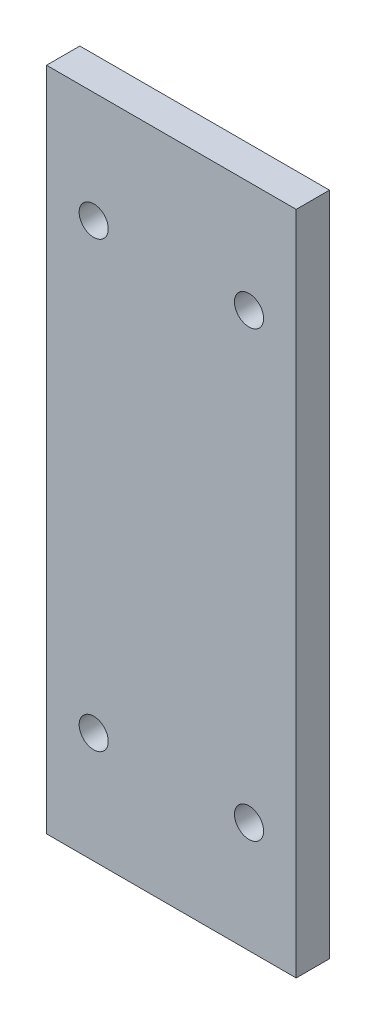
ISO-10303-21;
HEADER;
FILE_DESCRIPTION(('STEP AP214'),'2;1');
FILE_NAME('part.step','',(''),(''),'','','');
FILE_SCHEMA(('AUTOMOTIVE_DESIGN { 1 0 10303 214 1 1 1 1 }'));
ENDSEC;
DATA;
#1=APPLICATION_CONTEXT('core data for automotive mechanical design processes');
#2=APPLICATION_PROTOCOL_DEFINITION('international standard','automotive_design',2000,#1);
#3=PRODUCT_CONTEXT('',#1,'mechanical');
#4=PRODUCT('Part','Part','',(#3));
#5=PRODUCT_RELATED_PRODUCT_CATEGORY('part','',(#4));
#6=PRODUCT_DEFINITION_FORMATION('','',#4);
#7=PRODUCT_DEFINITION_CONTEXT('part definition',#1,'design');
#8=PRODUCT_DEFINITION('design','',#6,#7);
#9=PRODUCT_DEFINITION_SHAPE('','',#8);
#10=(LENGTH_UNIT() NAMED_UNIT(*) SI_UNIT(.MILLI.,.METRE.));
#11=(NAMED_UNIT(*) PLANE_ANGLE_UNIT() SI_UNIT($,.RADIAN.));
#12=(NAMED_UNIT(*) SI_UNIT($,.STERADIAN.) SOLID_ANGLE_UNIT());
#13=UNCERTAINTY_MEASURE_WITH_UNIT(LENGTH_MEASURE(1.E-05),#10,'distance_accuracy_value','');
#14=(GEOMETRIC_REPRESENTATION_CONTEXT(3) GLOBAL_UNCERTAINTY_ASSIGNED_CONTEXT((#13)) GLOBAL_UNIT_ASSIGNED_CONTEXT((#10,
#11,#12)) REPRESENTATION_CONTEXT('',''));
#15=CARTESIAN_POINT('',(0.,0.,0.));
#16=DIRECTION('',(0.,0.,1.));
#17=DIRECTION('',(1.,0.,0.));
#18=AXIS2_PLACEMENT_3D('',#15,#16,#17);
#19=CARTESIAN_POINT('',(5.0000000000001,-720.,12.));
#20=DIRECTION('',(-1.,0.,0.));
#21=DIRECTION('',(0.,-1.,0.));
#22=AXIS2_PLACEMENT_3D('',#19,#20,#21);
#23=PLANE('',#22);
#24=DIRECTION('',(0.,1.,0.));
#25=VECTOR('',#24,1.);
#26=CARTESIAN_POINT('',(5.0000000000001,-720.,0.));
#27=LINE('',#26,#25);
#28=CARTESIAN_POINT('',(5.0000000000001,-720.,0.));
#29=VERTEX_POINT('',#28);
#30=CARTESIAN_POINT('',(5.00000000000009,-480.,0.));
#31=VERTEX_POINT('',#30);
#32=EDGE_CURVE('E100',#29,#31,#27,.T.);
#33=ORIENTED_EDGE('',*,*,#32,.T.);
#34=DIRECTION('',(0.,0.,-1.));
#35=VECTOR('',#34,1.);
#36=CARTESIAN_POINT('',(5.00000000000009,-480.,12.));
#37=LINE('',#36,#35);
#38=CARTESIAN_POINT('',(5.00000000000009,-480.,12.));
#39=VERTEX_POINT('',#38);
#40=EDGE_CURVE('E11',#39,#31,#37,.T.);
#41=ORIENTED_EDGE('',*,*,#40,.F.);
#42=DIRECTION('',(0.,1.,0.));
#43=VECTOR('',#42,1.);
#44=CARTESIAN_POINT('',(5.0000000000001,-720.,12.));
#45=LINE('',#44,#43);
#46=CARTESIAN_POINT('',(5.0000000000001,-720.,12.));
#47=VERTEX_POINT('',#46);
#48=EDGE_CURVE('E88',#47,#39,#45,.T.);
#49=ORIENTED_EDGE('',*,*,#48,.F.);
#50=DIRECTION('',(0.,0.,-1.));
#51=VECTOR('',#50,1.);
#52=CARTESIAN_POINT('',(5.0000000000001,-720.,12.));
#53=LINE('',#52,#51);
#54=EDGE_CURVE('E96',#47,#29,#53,.T.);
#55=ORIENTED_EDGE('',*,*,#54,.T.);
#56=EDGE_LOOP('',(#33,#41,#49,#55));
#57=FACE_BOUND('',#56,.T.);
#58=ADVANCED_FACE('F37',(#57),#23,.F.);
#59=CARTESIAN_POINT('',(5.00000000000009,-480.,12.));
#60=DIRECTION('',(0.,-1.,0.));
#61=DIRECTION('',(0.,0.,-1.));
#62=AXIS2_PLACEMENT_3D('',#59,#60,#61);
#63=PLANE('',#62);
#64=DIRECTION('',(-1.,0.,0.));
#65=VECTOR('',#64,1.);
#66=CARTESIAN_POINT('',(5.00000000000009,-480.,0.));
#67=LINE('',#66,#65);
#68=CARTESIAN_POINT('',(-85.,-480.,0.));
#69=VERTEX_POINT('',#68);
#70=EDGE_CURVE('E92',#31,#69,#67,.T.);
#71=ORIENTED_EDGE('',*,*,#70,.T.);
#72=DIRECTION('',(0.,0.,-1.));
#73=VECTOR('',#72,1.);
#74=CARTESIAN_POINT('',(-85.,-480.,12.));
#75=LINE('',#74,#73);
#76=CARTESIAN_POINT('',(-85.,-480.,12.));
#77=VERTEX_POINT('',#76);
#78=EDGE_CURVE('E45',#77,#69,#75,.T.);
#79=ORIENTED_EDGE('',*,*,#78,.F.);
#80=DIRECTION('',(-1.,0.,0.));
#81=VECTOR('',#80,1.);
#82=CARTESIAN_POINT('',(5.00000000000009,-480.,12.));
#83=LINE('',#82,#81);
#84=EDGE_CURVE('E83',#39,#77,#83,.T.);
#85=ORIENTED_EDGE('',*,*,#84,.F.);
#86=ORIENTED_EDGE('',*,*,#40,.T.);
#87=EDGE_LOOP('',(#71,#79,#85,#86));
#88=FACE_BOUND('',#87,.T.);
#89=ADVANCED_FACE('F91',(#88),#63,.F.);
#90=CARTESIAN_POINT('',(-84.9999999999999,-720.,12.));
#91=DIRECTION('',(1.,0.,0.));
#92=DIRECTION('',(0.,1.,0.));
#93=AXIS2_PLACEMENT_3D('',#90,#91,#92);
#94=PLANE('',#93);
#95=DIRECTION('',(0.,-1.,0.));
#96=VECTOR('',#95,1.);
#97=CARTESIAN_POINT('',(-84.9999999999999,-720.,0.));
#98=LINE('',#97,#96);
#99=CARTESIAN_POINT('',(-84.9999999999999,-720.,0.));
#100=VERTEX_POINT('',#99);
#101=EDGE_CURVE('E70',#69,#100,#98,.T.);
#102=ORIENTED_EDGE('',*,*,#101,.T.);
#103=DIRECTION('',(0.,0.,-1.));
#104=VECTOR('',#103,1.);
#105=CARTESIAN_POINT('',(-84.9999999999999,-720.,12.));
#106=LINE('',#105,#104);
#107=CARTESIAN_POINT('',(-84.9999999999999,-720.,12.));
#108=VERTEX_POINT('',#107);
#109=EDGE_CURVE('E93',#108,#100,#106,.T.);
#110=ORIENTED_EDGE('',*,*,#109,.F.);
#111=DIRECTION('',(0.,-1.,0.));
#112=VECTOR('',#111,1.);
#113=CARTESIAN_POINT('',(-84.9999999999999,-720.,12.));
#114=LINE('',#113,#112);
#115=EDGE_CURVE('E86',#77,#108,#114,.T.);
#116=ORIENTED_EDGE('',*,*,#115,.F.);
#117=ORIENTED_EDGE('',*,*,#78,.T.);
#118=EDGE_LOOP('',(#102,#110,#116,#117));
#119=FACE_BOUND('',#118,.T.);
#120=ADVANCED_FACE('F94',(#119),#94,.F.);
#121=CARTESIAN_POINT('',(5.0000000000001,-720.,12.));
#122=DIRECTION('',(0.,1.,0.));
#123=DIRECTION('',(0.,0.,1.));
#124=AXIS2_PLACEMENT_3D('',#121,#122,#123);
#125=PLANE('',#124);
#126=DIRECTION('',(1.,0.,0.));
#127=VECTOR('',#126,1.);
#128=CARTESIAN_POINT('',(5.0000000000001,-720.,0.));
#129=LINE('',#128,#127);
#130=EDGE_CURVE('E76',#100,#29,#129,.T.);
#131=ORIENTED_EDGE('',*,*,#130,.T.);
#132=ORIENTED_EDGE('',*,*,#54,.F.);
#133=DIRECTION('',(1.,0.,0.));
#134=VECTOR('',#133,1.);
#135=CARTESIAN_POINT('',(5.0000000000001,-720.,12.));
#136=LINE('',#135,#134);
#137=EDGE_CURVE('E53',#108,#47,#136,.T.);
#138=ORIENTED_EDGE('',*,*,#137,.F.);
#139=ORIENTED_EDGE('',*,*,#109,.T.);
#140=EDGE_LOOP('',(#131,#132,#138,#139));
#141=FACE_BOUND('',#140,.T.);
#142=ADVANCED_FACE('F108',(#141),#125,.F.);
#143=CARTESIAN_POINT('',(5.00000000000009,-480.,12.));
#144=DIRECTION('',(0.,0.,1.));
#145=DIRECTION('',(1.,0.,0.));
#146=AXIS2_PLACEMENT_3D('',#143,#144,#145);
#147=PLANE('',#146);
#148=CARTESIAN_POINT('',(-67.9999999999999,-520.,12.));
#149=DIRECTION('',(0.,0.,1.));
#150=DIRECTION('',(1.,0.,0.));
#151=AXIS2_PLACEMENT_3D('',#148,#149,#150);
#152=CIRCLE('',#151,5.25);
#153=CARTESIAN_POINT('',(-62.7499999999999,-520.,12.));
#154=VERTEX_POINT('',#153);
#155=EDGE_CURVE('E134',#154,#154,#152,.T.);
#156=ORIENTED_EDGE('',*,*,#155,.F.);
#157=EDGE_LOOP('',(#156));
#158=FACE_BOUND('',#157,.T.);
#159=CARTESIAN_POINT('',(-67.9999999999999,-680.,12.));
#160=DIRECTION('',(0.,0.,1.));
#161=DIRECTION('',(1.,0.,0.));
#162=AXIS2_PLACEMENT_3D('',#159,#160,#161);
#163=CIRCLE('',#162,5.25);
#164=CARTESIAN_POINT('',(-62.7499999999999,-680.,12.));
#165=VERTEX_POINT('',#164);
#166=EDGE_CURVE('E128',#165,#165,#163,.T.);
#167=ORIENTED_EDGE('',*,*,#166,.F.);
#168=EDGE_LOOP('',(#167));
#169=FACE_BOUND('',#168,.T.);
#170=CARTESIAN_POINT('',(-11.9999999999999,-680.,12.));
#171=DIRECTION('',(0.,0.,1.));
#172=DIRECTION('',(1.,0.,0.));
#173=AXIS2_PLACEMENT_3D('',#170,#171,#172);
#174=CIRCLE('',#173,5.25);
#175=CARTESIAN_POINT('',(-6.74999999999994,-680.,12.));
#176=VERTEX_POINT('',#175);
#177=EDGE_CURVE('E122',#176,#176,#174,.T.);
#178=ORIENTED_EDGE('',*,*,#177,.F.);
#179=EDGE_LOOP('',(#178));
#180=FACE_BOUND('',#179,.T.);
#181=CARTESIAN_POINT('',(-11.9999999999999,-520.,12.));
#182=DIRECTION('',(0.,0.,1.));
#183=DIRECTION('',(1.,0.,0.));
#184=AXIS2_PLACEMENT_3D('',#181,#182,#183);
#185=CIRCLE('',#184,5.25);
#186=CARTESIAN_POINT('',(-6.74999999999994,-520.,12.));
#187=VERTEX_POINT('',#186);
#188=EDGE_CURVE('E116',#187,#187,#185,.T.);
#189=ORIENTED_EDGE('',*,*,#188,.F.);
#190=EDGE_LOOP('',(#189));
#191=FACE_BOUND('',#190,.T.);
#192=ORIENTED_EDGE('',*,*,#48,.T.);
#193=ORIENTED_EDGE('',*,*,#84,.T.);
#194=ORIENTED_EDGE('',*,*,#115,.T.);
#195=ORIENTED_EDGE('',*,*,#137,.T.);
#196=EDGE_LOOP('',(#192,#193,#194,#195));
#197=FACE_BOUND('',#196,.T.);
#198=ADVANCED_FACE('F84',(#158,#169,#180,#191,#197),#147,.T.);
#199=CARTESIAN_POINT('',(5.00000000000009,-480.,0.));
#200=DIRECTION('',(0.,0.,1.));
#201=DIRECTION('',(1.,0.,0.));
#202=AXIS2_PLACEMENT_3D('',#199,#200,#201);
#203=PLANE('',#202);
#204=CARTESIAN_POINT('',(-67.9999999999999,-520.,0.));
#205=DIRECTION('',(0.,0.,1.));
#206=DIRECTION('',(1.,0.,0.));
#207=AXIS2_PLACEMENT_3D('',#204,#205,#206);
#208=CIRCLE('',#207,5.24999999999999);
#209=CARTESIAN_POINT('',(-62.7499999999999,-520.,0.));
#210=VERTEX_POINT('',#209);
#211=EDGE_CURVE('E131',#210,#210,#208,.T.);
#212=ORIENTED_EDGE('',*,*,#211,.T.);
#213=EDGE_LOOP('',(#212));
#214=FACE_BOUND('',#213,.T.);
#215=CARTESIAN_POINT('',(-67.9999999999999,-680.,0.));
#216=DIRECTION('',(0.,0.,1.));
#217=DIRECTION('',(1.,0.,0.));
#218=AXIS2_PLACEMENT_3D('',#215,#216,#217);
#219=CIRCLE('',#218,5.24999999999999);
#220=CARTESIAN_POINT('',(-62.7499999999999,-680.,0.));
#221=VERTEX_POINT('',#220);
#222=EDGE_CURVE('E125',#221,#221,#219,.T.);
#223=ORIENTED_EDGE('',*,*,#222,.T.);
#224=EDGE_LOOP('',(#223));
#225=FACE_BOUND('',#224,.T.);
#226=CARTESIAN_POINT('',(-11.9999999999999,-680.,0.));
#227=DIRECTION('',(0.,0.,1.));
#228=DIRECTION('',(1.,0.,0.));
#229=AXIS2_PLACEMENT_3D('',#226,#227,#228);
#230=CIRCLE('',#229,5.25);
#231=CARTESIAN_POINT('',(-6.74999999999994,-680.,0.));
#232=VERTEX_POINT('',#231);
#233=EDGE_CURVE('E119',#232,#232,#230,.T.);
#234=ORIENTED_EDGE('',*,*,#233,.T.);
#235=EDGE_LOOP('',(#234));
#236=FACE_BOUND('',#235,.T.);
#237=CARTESIAN_POINT('',(-11.9999999999999,-520.,0.));
#238=DIRECTION('',(0.,0.,1.));
#239=DIRECTION('',(1.,0.,0.));
#240=AXIS2_PLACEMENT_3D('',#237,#238,#239);
#241=CIRCLE('',#240,5.25);
#242=CARTESIAN_POINT('',(-6.74999999999994,-520.,0.));
#243=VERTEX_POINT('',#242);
#244=EDGE_CURVE('E103',#243,#243,#241,.T.);
#245=ORIENTED_EDGE('',*,*,#244,.T.);
#246=EDGE_LOOP('',(#245));
#247=FACE_BOUND('',#246,.T.);
#248=ORIENTED_EDGE('',*,*,#32,.F.);
#249=ORIENTED_EDGE('',*,*,#130,.F.);
#250=ORIENTED_EDGE('',*,*,#101,.F.);
#251=ORIENTED_EDGE('',*,*,#70,.F.);
#252=EDGE_LOOP('',(#248,#249,#250,#251));
#253=FACE_BOUND('',#252,.T.);
#254=ADVANCED_FACE('F111',(#214,#225,#236,#247,#253),#203,.F.);
#255=CARTESIAN_POINT('',(-11.9999999999999,-520.,12.));
#256=DIRECTION('',(0.,0.,1.));
#257=DIRECTION('',(1.,0.,0.));
#258=AXIS2_PLACEMENT_3D('',#255,#256,#257);
#259=CYLINDRICAL_SURFACE('',#258,5.25);
#260=ORIENTED_EDGE('',*,*,#244,.F.);
#261=EDGE_LOOP('',(#260));
#262=FACE_BOUND('',#261,.T.);
#263=ORIENTED_EDGE('',*,*,#188,.T.);
#264=EDGE_LOOP('',(#263));
#265=FACE_BOUND('',#264,.T.);
#266=ADVANCED_FACE('F149',(#262,#265),#259,.F.);
#267=CARTESIAN_POINT('',(-11.9999999999999,-680.,12.));
#268=DIRECTION('',(0.,0.,1.));
#269=DIRECTION('',(1.,0.,0.));
#270=AXIS2_PLACEMENT_3D('',#267,#268,#269);
#271=CYLINDRICAL_SURFACE('',#270,5.25);
#272=ORIENTED_EDGE('',*,*,#233,.F.);
#273=EDGE_LOOP('',(#272));
#274=FACE_BOUND('',#273,.T.);
#275=ORIENTED_EDGE('',*,*,#177,.T.);
#276=EDGE_LOOP('',(#275));
#277=FACE_BOUND('',#276,.T.);
#278=ADVANCED_FACE('F151',(#274,#277),#271,.F.);
#279=CARTESIAN_POINT('',(-67.9999999999999,-680.,12.));
#280=DIRECTION('',(0.,0.,1.));
#281=DIRECTION('',(1.,0.,0.));
#282=AXIS2_PLACEMENT_3D('',#279,#280,#281);
#283=CYLINDRICAL_SURFACE('',#282,5.25);
#284=ORIENTED_EDGE('',*,*,#222,.F.);
#285=EDGE_LOOP('',(#284));
#286=FACE_BOUND('',#285,.T.);
#287=ORIENTED_EDGE('',*,*,#166,.T.);
#288=EDGE_LOOP('',(#287));
#289=FACE_BOUND('',#288,.T.);
#290=ADVANCED_FACE('F158',(#286,#289),#283,.F.);
#291=CARTESIAN_POINT('',(-67.9999999999999,-520.,12.));
#292=DIRECTION('',(0.,0.,1.));
#293=DIRECTION('',(1.,0.,0.));
#294=AXIS2_PLACEMENT_3D('',#291,#292,#293);
#295=CYLINDRICAL_SURFACE('',#294,5.25);
#296=ORIENTED_EDGE('',*,*,#211,.F.);
#297=EDGE_LOOP('',(#296));
#298=FACE_BOUND('',#297,.T.);
#299=ORIENTED_EDGE('',*,*,#155,.T.);
#300=EDGE_LOOP('',(#299));
#301=FACE_BOUND('',#300,.T.);
#302=ADVANCED_FACE('F138',(#298,#301),#295,.F.);
#303=CLOSED_SHELL('',(#58,#89,#120,#142,#198,#254,#266,#278,#290,#302));
#304=MANIFOLD_SOLID_BREP('B2',#303);
#305=ADVANCED_BREP_SHAPE_REPRESENTATION('',(#18,#304),#14);
#306=SHAPE_DEFINITION_REPRESENTATION(#9,#305);
ENDSEC;
END-ISO-10303-21;
